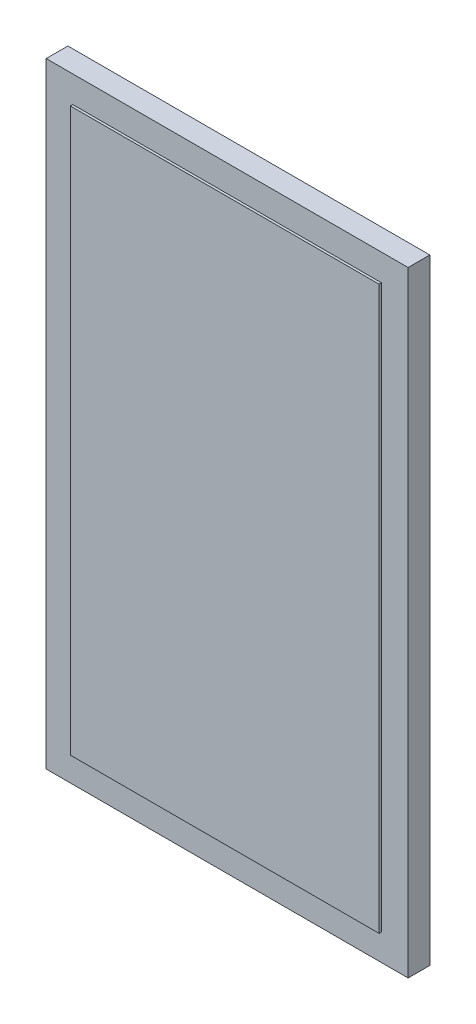
ISO-10303-21;
HEADER;
FILE_DESCRIPTION(('STEP AP214'),'2;1');
FILE_NAME('part.step','',(''),(''),'','','');
FILE_SCHEMA(('AUTOMOTIVE_DESIGN { 1 0 10303 214 1 1 1 1 }'));
ENDSEC;
DATA;
#1=APPLICATION_CONTEXT('core data for automotive mechanical design processes');
#2=APPLICATION_PROTOCOL_DEFINITION('international standard','automotive_design',2000,#1);
#3=PRODUCT_CONTEXT('',#1,'mechanical');
#4=PRODUCT('Part','Part','',(#3));
#5=PRODUCT_RELATED_PRODUCT_CATEGORY('part','',(#4));
#6=PRODUCT_DEFINITION_FORMATION('','',#4);
#7=PRODUCT_DEFINITION_CONTEXT('part definition',#1,'design');
#8=PRODUCT_DEFINITION('design','',#6,#7);
#9=PRODUCT_DEFINITION_SHAPE('','',#8);
#10=(LENGTH_UNIT() NAMED_UNIT(*) SI_UNIT(.MILLI.,.METRE.));
#11=(NAMED_UNIT(*) PLANE_ANGLE_UNIT() SI_UNIT($,.RADIAN.));
#12=(NAMED_UNIT(*) SI_UNIT($,.STERADIAN.) SOLID_ANGLE_UNIT());
#13=UNCERTAINTY_MEASURE_WITH_UNIT(LENGTH_MEASURE(1.E-05),#10,'distance_accuracy_value','');
#14=(GEOMETRIC_REPRESENTATION_CONTEXT(3) GLOBAL_UNCERTAINTY_ASSIGNED_CONTEXT((#13)) GLOBAL_UNIT_ASSIGNED_CONTEXT((#10,
#11,#12)) REPRESENTATION_CONTEXT('',''));
#15=CARTESIAN_POINT('',(0.,0.,0.));
#16=DIRECTION('',(0.,0.,1.));
#17=DIRECTION('',(1.,0.,0.));
#18=AXIS2_PLACEMENT_3D('',#15,#16,#17);
#19=CARTESIAN_POINT('',(75.,127.5,10.));
#20=DIRECTION('',(-1.,0.,0.));
#21=DIRECTION('',(0.,-1.,0.));
#22=AXIS2_PLACEMENT_3D('',#19,#20,#21);
#23=PLANE('',#22);
#24=DIRECTION('',(0.,1.,0.));
#25=VECTOR('',#24,1.);
#26=CARTESIAN_POINT('',(75.,127.5,9.));
#27=LINE('',#26,#25);
#28=CARTESIAN_POINT('',(75.,-127.5,9.));
#29=VERTEX_POINT('',#28);
#30=CARTESIAN_POINT('',(75.,127.5,9.));
#31=VERTEX_POINT('',#30);
#32=EDGE_CURVE('E137',#29,#31,#27,.T.);
#33=ORIENTED_EDGE('',*,*,#32,.F.);
#34=DIRECTION('',(0.,0.,-1.));
#35=VECTOR('',#34,1.);
#36=CARTESIAN_POINT('',(75.,-127.5,10.));
#37=LINE('',#36,#35);
#38=CARTESIAN_POINT('',(75.,-127.5,0.));
#39=VERTEX_POINT('',#38);
#40=EDGE_CURVE('E159',#29,#39,#37,.T.);
#41=ORIENTED_EDGE('',*,*,#40,.T.);
#42=DIRECTION('',(0.,1.,0.));
#43=VECTOR('',#42,1.);
#44=CARTESIAN_POINT('',(75.,127.5,0.));
#45=LINE('',#44,#43);
#46=CARTESIAN_POINT('',(75.,127.5,0.));
#47=VERTEX_POINT('',#46);
#48=EDGE_CURVE('E147',#39,#47,#45,.T.);
#49=ORIENTED_EDGE('',*,*,#48,.T.);
#50=DIRECTION('',(0.,0.,-1.));
#51=VECTOR('',#50,1.);
#52=CARTESIAN_POINT('',(75.,127.5,10.));
#53=LINE('',#52,#51);
#54=EDGE_CURVE('E11',#31,#47,#53,.T.);
#55=ORIENTED_EDGE('',*,*,#54,.F.);
#56=EDGE_LOOP('',(#33,#41,#49,#55));
#57=FACE_BOUND('',#56,.T.);
#58=ADVANCED_FACE('F37',(#57),#23,.F.);
#59=CARTESIAN_POINT('',(-75.,127.5,10.));
#60=DIRECTION('',(0.,-1.,0.));
#61=DIRECTION('',(0.,0.,-1.));
#62=AXIS2_PLACEMENT_3D('',#59,#60,#61);
#63=PLANE('',#62);
#64=DIRECTION('',(-1.,0.,0.));
#65=VECTOR('',#64,1.);
#66=CARTESIAN_POINT('',(-75.,127.5,9.));
#67=LINE('',#66,#65);
#68=CARTESIAN_POINT('',(-75.,127.5,9.));
#69=VERTEX_POINT('',#68);
#70=EDGE_CURVE('E142',#31,#69,#67,.T.);
#71=ORIENTED_EDGE('',*,*,#70,.F.);
#72=ORIENTED_EDGE('',*,*,#54,.T.);
#73=DIRECTION('',(-1.,0.,0.));
#74=VECTOR('',#73,1.);
#75=CARTESIAN_POINT('',(-75.,127.5,0.));
#76=LINE('',#75,#74);
#77=CARTESIAN_POINT('',(-75.,127.5,0.));
#78=VERTEX_POINT('',#77);
#79=EDGE_CURVE('E150',#47,#78,#76,.T.);
#80=ORIENTED_EDGE('',*,*,#79,.T.);
#81=DIRECTION('',(0.,0.,-1.));
#82=VECTOR('',#81,1.);
#83=CARTESIAN_POINT('',(-75.,127.5,10.));
#84=LINE('',#83,#82);
#85=EDGE_CURVE('E44',#69,#78,#84,.T.);
#86=ORIENTED_EDGE('',*,*,#85,.F.);
#87=EDGE_LOOP('',(#71,#72,#80,#86));
#88=FACE_BOUND('',#87,.T.);
#89=ADVANCED_FACE('F171',(#88),#63,.F.);
#90=CARTESIAN_POINT('',(-75.,127.5,10.));
#91=DIRECTION('',(1.,0.,0.));
#92=DIRECTION('',(0.,1.,0.));
#93=AXIS2_PLACEMENT_3D('',#90,#91,#92);
#94=PLANE('',#93);
#95=DIRECTION('',(0.,-1.,0.));
#96=VECTOR('',#95,1.);
#97=CARTESIAN_POINT('',(-75.,127.5,9.));
#98=LINE('',#97,#96);
#99=CARTESIAN_POINT('',(-75.,-127.5,9.));
#100=VERTEX_POINT('',#99);
#101=EDGE_CURVE('E51',#69,#100,#98,.T.);
#102=ORIENTED_EDGE('',*,*,#101,.F.);
#103=ORIENTED_EDGE('',*,*,#85,.T.);
#104=DIRECTION('',(0.,-1.,0.));
#105=VECTOR('',#104,1.);
#106=CARTESIAN_POINT('',(-75.,127.5,0.));
#107=LINE('',#106,#105);
#108=CARTESIAN_POINT('',(-75.,-127.5,0.));
#109=VERTEX_POINT('',#108);
#110=EDGE_CURVE('E153',#78,#109,#107,.T.);
#111=ORIENTED_EDGE('',*,*,#110,.T.);
#112=DIRECTION('',(0.,0.,-1.));
#113=VECTOR('',#112,1.);
#114=CARTESIAN_POINT('',(-75.,-127.5,10.));
#115=LINE('',#114,#113);
#116=EDGE_CURVE('E161',#100,#109,#115,.T.);
#117=ORIENTED_EDGE('',*,*,#116,.F.);
#118=EDGE_LOOP('',(#102,#103,#111,#117));
#119=FACE_BOUND('',#118,.T.);
#120=ADVANCED_FACE('F164',(#119),#94,.F.);
#121=CARTESIAN_POINT('',(-75.,-127.5,10.));
#122=DIRECTION('',(0.,1.,0.));
#123=DIRECTION('',(0.,0.,1.));
#124=AXIS2_PLACEMENT_3D('',#121,#122,#123);
#125=PLANE('',#124);
#126=DIRECTION('',(1.,0.,0.));
#127=VECTOR('',#126,1.);
#128=CARTESIAN_POINT('',(-75.,-127.5,9.));
#129=LINE('',#128,#127);
#130=EDGE_CURVE('E145',#100,#29,#129,.T.);
#131=ORIENTED_EDGE('',*,*,#130,.F.);
#132=ORIENTED_EDGE('',*,*,#116,.T.);
#133=DIRECTION('',(1.,0.,0.));
#134=VECTOR('',#133,1.);
#135=CARTESIAN_POINT('',(-75.,-127.5,0.));
#136=LINE('',#135,#134);
#137=EDGE_CURVE('E156',#109,#39,#136,.T.);
#138=ORIENTED_EDGE('',*,*,#137,.T.);
#139=ORIENTED_EDGE('',*,*,#40,.F.);
#140=EDGE_LOOP('',(#131,#132,#138,#139));
#141=FACE_BOUND('',#140,.T.);
#142=ADVANCED_FACE('F178',(#141),#125,.F.);
#143=CARTESIAN_POINT('',(0.,0.,0.));
#144=DIRECTION('',(0.,0.,1.));
#145=DIRECTION('',(1.,0.,0.));
#146=AXIS2_PLACEMENT_3D('',#143,#144,#145);
#147=PLANE('',#146);
#148=ORIENTED_EDGE('',*,*,#48,.F.);
#149=ORIENTED_EDGE('',*,*,#137,.F.);
#150=ORIENTED_EDGE('',*,*,#110,.F.);
#151=ORIENTED_EDGE('',*,*,#79,.F.);
#152=EDGE_LOOP('',(#148,#149,#150,#151));
#153=FACE_BOUND('',#152,.T.);
#154=ADVANCED_FACE('F175',(#153),#147,.F.);
#155=CARTESIAN_POINT('',(0.,0.,9.));
#156=DIRECTION('',(0.,0.,1.));
#157=DIRECTION('',(1.,0.,0.));
#158=AXIS2_PLACEMENT_3D('',#155,#156,#157);
#159=PLANE('',#158);
#160=DIRECTION('',(1.,0.,0.));
#161=VECTOR('',#160,1.);
#162=CARTESIAN_POINT('',(-64.,-116.5,9.));
#163=LINE('',#162,#161);
#164=CARTESIAN_POINT('',(-64.,-116.5,9.));
#165=VERTEX_POINT('',#164);
#166=CARTESIAN_POINT('',(64.,-116.5,9.));
#167=VERTEX_POINT('',#166);
#168=EDGE_CURVE('E112',#165,#167,#163,.T.);
#169=ORIENTED_EDGE('',*,*,#168,.F.);
#170=DIRECTION('',(0.,-1.,0.));
#171=VECTOR('',#170,1.);
#172=CARTESIAN_POINT('',(-64.,116.5,9.));
#173=LINE('',#172,#171);
#174=CARTESIAN_POINT('',(-64.,116.5,9.));
#175=VERTEX_POINT('',#174);
#176=EDGE_CURVE('E121',#175,#165,#173,.T.);
#177=ORIENTED_EDGE('',*,*,#176,.F.);
#178=DIRECTION('',(-1.,0.,0.));
#179=VECTOR('',#178,1.);
#180=CARTESIAN_POINT('',(-64.,116.5,9.));
#181=LINE('',#180,#179);
#182=CARTESIAN_POINT('',(64.,116.5,9.));
#183=VERTEX_POINT('',#182);
#184=EDGE_CURVE('E104',#183,#175,#181,.T.);
#185=ORIENTED_EDGE('',*,*,#184,.F.);
#186=DIRECTION('',(0.,1.,0.));
#187=VECTOR('',#186,1.);
#188=CARTESIAN_POINT('',(64.,116.5,9.));
#189=LINE('',#188,#187);
#190=EDGE_CURVE('E118',#167,#183,#189,.T.);
#191=ORIENTED_EDGE('',*,*,#190,.F.);
#192=EDGE_LOOP('',(#169,#177,#185,#191));
#193=FACE_BOUND('',#192,.T.);
#194=ORIENTED_EDGE('',*,*,#32,.T.);
#195=ORIENTED_EDGE('',*,*,#70,.T.);
#196=ORIENTED_EDGE('',*,*,#101,.T.);
#197=ORIENTED_EDGE('',*,*,#130,.T.);
#198=EDGE_LOOP('',(#194,#195,#196,#197));
#199=FACE_BOUND('',#198,.T.);
#200=ADVANCED_FACE('F117',(#193,#199),#159,.T.);
#201=CARTESIAN_POINT('',(64.,116.5,9.));
#202=DIRECTION('',(1.,0.,0.));
#203=DIRECTION('',(0.,0.,-1.));
#204=AXIS2_PLACEMENT_3D('',#201,#202,#203);
#205=PLANE('',#204);
#206=DIRECTION('',(0.,1.,0.));
#207=VECTOR('',#206,1.);
#208=CARTESIAN_POINT('',(64.,116.5,10.));
#209=LINE('',#208,#207);
#210=CARTESIAN_POINT('',(64.,-116.5,10.));
#211=VERTEX_POINT('',#210);
#212=CARTESIAN_POINT('',(64.,116.5,10.));
#213=VERTEX_POINT('',#212);
#214=EDGE_CURVE('E132',#211,#213,#209,.T.);
#215=ORIENTED_EDGE('',*,*,#214,.F.);
#216=DIRECTION('',(0.,0.,1.));
#217=VECTOR('',#216,1.);
#218=CARTESIAN_POINT('',(64.,-116.5,9.));
#219=LINE('',#218,#217);
#220=EDGE_CURVE('E124',#167,#211,#219,.T.);
#221=ORIENTED_EDGE('',*,*,#220,.F.);
#222=ORIENTED_EDGE('',*,*,#190,.T.);
#223=DIRECTION('',(0.,0.,1.));
#224=VECTOR('',#223,1.);
#225=CARTESIAN_POINT('',(64.,116.5,9.));
#226=LINE('',#225,#224);
#227=EDGE_CURVE('E101',#183,#213,#226,.T.);
#228=ORIENTED_EDGE('',*,*,#227,.T.);
#229=EDGE_LOOP('',(#215,#221,#222,#228));
#230=FACE_BOUND('',#229,.T.);
#231=ADVANCED_FACE('F123',(#230),#205,.T.);
#232=CARTESIAN_POINT('',(-64.,-116.5,9.));
#233=DIRECTION('',(0.,-1.,0.));
#234=DIRECTION('',(0.,0.,-1.));
#235=AXIS2_PLACEMENT_3D('',#232,#233,#234);
#236=PLANE('',#235);
#237=DIRECTION('',(1.,0.,0.));
#238=VECTOR('',#237,1.);
#239=CARTESIAN_POINT('',(-64.,-116.5,10.));
#240=LINE('',#239,#238);
#241=CARTESIAN_POINT('',(-64.,-116.5,10.));
#242=VERTEX_POINT('',#241);
#243=EDGE_CURVE('E125',#242,#211,#240,.T.);
#244=ORIENTED_EDGE('',*,*,#243,.F.);
#245=DIRECTION('',(0.,0.,1.));
#246=VECTOR('',#245,1.);
#247=CARTESIAN_POINT('',(-64.,-116.5,9.));
#248=LINE('',#247,#246);
#249=EDGE_CURVE('E138',#165,#242,#248,.T.);
#250=ORIENTED_EDGE('',*,*,#249,.F.);
#251=ORIENTED_EDGE('',*,*,#168,.T.);
#252=ORIENTED_EDGE('',*,*,#220,.T.);
#253=EDGE_LOOP('',(#244,#250,#251,#252));
#254=FACE_BOUND('',#253,.T.);
#255=ADVANCED_FACE('F202',(#254),#236,.T.);
#256=CARTESIAN_POINT('',(-64.,116.5,9.));
#257=DIRECTION('',(-1.,0.,0.));
#258=DIRECTION('',(0.,0.,1.));
#259=AXIS2_PLACEMENT_3D('',#256,#257,#258);
#260=PLANE('',#259);
#261=DIRECTION('',(0.,-1.,0.));
#262=VECTOR('',#261,1.);
#263=CARTESIAN_POINT('',(-64.,116.5,10.));
#264=LINE('',#263,#262);
#265=CARTESIAN_POINT('',(-64.,116.5,10.));
#266=VERTEX_POINT('',#265);
#267=EDGE_CURVE('E59',#266,#242,#264,.T.);
#268=ORIENTED_EDGE('',*,*,#267,.F.);
#269=DIRECTION('',(0.,0.,1.));
#270=VECTOR('',#269,1.);
#271=CARTESIAN_POINT('',(-64.,116.5,9.));
#272=LINE('',#271,#270);
#273=EDGE_CURVE('E111',#175,#266,#272,.T.);
#274=ORIENTED_EDGE('',*,*,#273,.F.);
#275=ORIENTED_EDGE('',*,*,#176,.T.);
#276=ORIENTED_EDGE('',*,*,#249,.T.);
#277=EDGE_LOOP('',(#268,#274,#275,#276));
#278=FACE_BOUND('',#277,.T.);
#279=ADVANCED_FACE('F205',(#278),#260,.T.);
#280=CARTESIAN_POINT('',(-64.,116.5,9.));
#281=DIRECTION('',(0.,1.,0.));
#282=DIRECTION('',(0.,0.,1.));
#283=AXIS2_PLACEMENT_3D('',#280,#281,#282);
#284=PLANE('',#283);
#285=DIRECTION('',(-1.,0.,0.));
#286=VECTOR('',#285,1.);
#287=CARTESIAN_POINT('',(-64.,116.5,10.));
#288=LINE('',#287,#286);
#289=EDGE_CURVE('E106',#213,#266,#288,.T.);
#290=ORIENTED_EDGE('',*,*,#289,.F.);
#291=ORIENTED_EDGE('',*,*,#227,.F.);
#292=ORIENTED_EDGE('',*,*,#184,.T.);
#293=ORIENTED_EDGE('',*,*,#273,.T.);
#294=EDGE_LOOP('',(#290,#291,#292,#293));
#295=FACE_BOUND('',#294,.T.);
#296=ADVANCED_FACE('F103',(#295),#284,.T.);
#297=CARTESIAN_POINT('',(0.,0.,10.));
#298=DIRECTION('',(0.,0.,1.));
#299=DIRECTION('',(1.,0.,0.));
#300=AXIS2_PLACEMENT_3D('',#297,#298,#299);
#301=PLANE('',#300);
#302=ORIENTED_EDGE('',*,*,#243,.T.);
#303=ORIENTED_EDGE('',*,*,#214,.T.);
#304=ORIENTED_EDGE('',*,*,#289,.T.);
#305=ORIENTED_EDGE('',*,*,#267,.T.);
#306=EDGE_LOOP('',(#302,#303,#304,#305));
#307=FACE_BOUND('',#306,.T.);
#308=ADVANCED_FACE('F194',(#307),#301,.T.);
#309=CLOSED_SHELL('',(#58,#89,#120,#142,#154,#200,#231,#255,#279,#296,#308));
#310=MANIFOLD_SOLID_BREP('B2',#309);
#311=ADVANCED_BREP_SHAPE_REPRESENTATION('',(#18,#310),#14);
#312=SHAPE_DEFINITION_REPRESENTATION(#9,#311);
ENDSEC;
END-ISO-10303-21;
